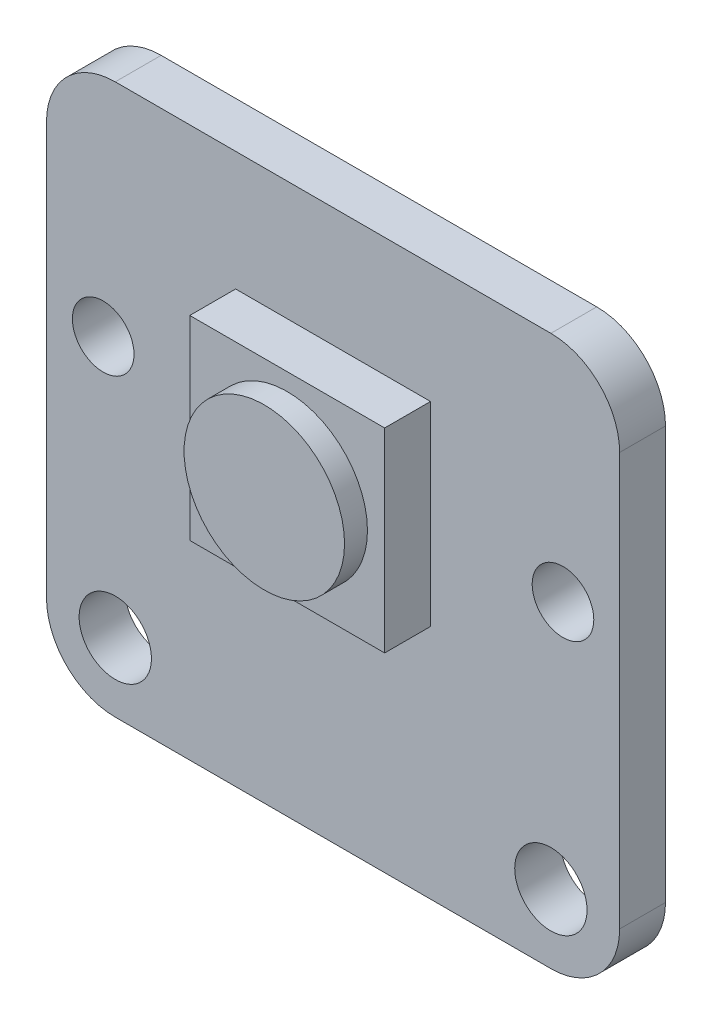
ISO-10303-21;
HEADER;
FILE_DESCRIPTION(('STEP AP214'),'2;1');
FILE_NAME('part.step','',(''),(''),'','','');
FILE_SCHEMA(('AUTOMOTIVE_DESIGN { 1 0 10303 214 1 1 1 1 }'));
ENDSEC;
DATA;
#1=APPLICATION_CONTEXT('core data for automotive mechanical design processes');
#2=APPLICATION_PROTOCOL_DEFINITION('international standard','automotive_design',2000,#1);
#3=PRODUCT_CONTEXT('',#1,'mechanical');
#4=PRODUCT('Part','Part','',(#3));
#5=PRODUCT_RELATED_PRODUCT_CATEGORY('part','',(#4));
#6=PRODUCT_DEFINITION_FORMATION('','',#4);
#7=PRODUCT_DEFINITION_CONTEXT('part definition',#1,'design');
#8=PRODUCT_DEFINITION('design','',#6,#7);
#9=PRODUCT_DEFINITION_SHAPE('','',#8);
#10=(LENGTH_UNIT() NAMED_UNIT(*) SI_UNIT(.MILLI.,.METRE.));
#11=(NAMED_UNIT(*) PLANE_ANGLE_UNIT() SI_UNIT($,.RADIAN.));
#12=(NAMED_UNIT(*) SI_UNIT($,.STERADIAN.) SOLID_ANGLE_UNIT());
#13=UNCERTAINTY_MEASURE_WITH_UNIT(LENGTH_MEASURE(1.E-05),#10,'distance_accuracy_value','');
#14=(GEOMETRIC_REPRESENTATION_CONTEXT(3) GLOBAL_UNCERTAINTY_ASSIGNED_CONTEXT((#13)) GLOBAL_UNIT_ASSIGNED_CONTEXT((#10,
#11,#12)) REPRESENTATION_CONTEXT('',''));
#15=CARTESIAN_POINT('',(0.,0.,0.));
#16=DIRECTION('',(0.,0.,1.));
#17=DIRECTION('',(1.,0.,0.));
#18=AXIS2_PLACEMENT_3D('',#15,#16,#17);
#19=CARTESIAN_POINT('',(9.5,-9.,2.));
#20=DIRECTION('',(0.,0.,-1.));
#21=DIRECTION('',(-1.,0.,0.));
#22=AXIS2_PLACEMENT_3D('',#19,#20,#21);
#23=CYLINDRICAL_SURFACE('',#22,3.);
#24=DIRECTION('',(0.,0.,-1.));
#25=VECTOR('',#24,1.);
#26=CARTESIAN_POINT('',(12.5,-9.,2.));
#27=LINE('',#26,#25);
#28=CARTESIAN_POINT('',(12.5,-9.,2.));
#29=VERTEX_POINT('',#28);
#30=CARTESIAN_POINT('',(12.5,-9.,0.));
#31=VERTEX_POINT('',#30);
#32=EDGE_CURVE('E240',#29,#31,#27,.T.);
#33=ORIENTED_EDGE('',*,*,#32,.F.);
#34=CARTESIAN_POINT('',(9.5,-9.,2.));
#35=DIRECTION('',(0.,0.,1.));
#36=DIRECTION('',(1.,0.,0.));
#37=AXIS2_PLACEMENT_3D('',#34,#35,#36);
#38=CIRCLE('',#37,3.);
#39=CARTESIAN_POINT('',(9.5,-12.,2.));
#40=VERTEX_POINT('',#39);
#41=EDGE_CURVE('E54',#40,#29,#38,.T.);
#42=ORIENTED_EDGE('',*,*,#41,.F.);
#43=DIRECTION('',(0.,0.,-1.));
#44=VECTOR('',#43,1.);
#45=CARTESIAN_POINT('',(9.5,-12.,2.));
#46=LINE('',#45,#44);
#47=CARTESIAN_POINT('',(9.5,-12.,0.));
#48=VERTEX_POINT('',#47);
#49=EDGE_CURVE('E244',#48,#40,#46,.F.);
#50=ORIENTED_EDGE('',*,*,#49,.F.);
#51=CARTESIAN_POINT('',(9.5,-9.,0.));
#52=DIRECTION('',(0.,0.,1.));
#53=DIRECTION('',(1.,0.,0.));
#54=AXIS2_PLACEMENT_3D('',#51,#52,#53);
#55=CIRCLE('',#54,3.);
#56=EDGE_CURVE('E11',#31,#48,#55,.F.);
#57=ORIENTED_EDGE('',*,*,#56,.F.);
#58=EDGE_LOOP('',(#33,#42,#50,#57));
#59=FACE_BOUND('',#58,.T.);
#60=ADVANCED_FACE('F45',(#59),#23,.T.);
#61=CARTESIAN_POINT('',(9.5,9.,2.));
#62=DIRECTION('',(0.,0.,-1.));
#63=DIRECTION('',(-1.,0.,0.));
#64=AXIS2_PLACEMENT_3D('',#61,#62,#63);
#65=CYLINDRICAL_SURFACE('',#64,3.);
#66=DIRECTION('',(0.,0.,-1.));
#67=VECTOR('',#66,1.);
#68=CARTESIAN_POINT('',(9.5,12.,2.));
#69=LINE('',#68,#67);
#70=CARTESIAN_POINT('',(9.5,12.,2.));
#71=VERTEX_POINT('',#70);
#72=CARTESIAN_POINT('',(9.5,12.,0.));
#73=VERTEX_POINT('',#72);
#74=EDGE_CURVE('E225',#71,#73,#69,.T.);
#75=ORIENTED_EDGE('',*,*,#74,.F.);
#76=CARTESIAN_POINT('',(9.5,9.,2.));
#77=DIRECTION('',(0.,0.,1.));
#78=DIRECTION('',(1.,0.,0.));
#79=AXIS2_PLACEMENT_3D('',#76,#77,#78);
#80=CIRCLE('',#79,3.);
#81=CARTESIAN_POINT('',(12.5,9.,2.));
#82=VERTEX_POINT('',#81);
#83=EDGE_CURVE('E233',#82,#71,#80,.T.);
#84=ORIENTED_EDGE('',*,*,#83,.F.);
#85=DIRECTION('',(0.,0.,-1.));
#86=VECTOR('',#85,1.);
#87=CARTESIAN_POINT('',(12.5,9.,2.));
#88=LINE('',#87,#86);
#89=CARTESIAN_POINT('',(12.5,9.,0.));
#90=VERTEX_POINT('',#89);
#91=EDGE_CURVE('E229',#90,#82,#88,.F.);
#92=ORIENTED_EDGE('',*,*,#91,.F.);
#93=CARTESIAN_POINT('',(9.5,9.,0.));
#94=DIRECTION('',(0.,0.,1.));
#95=DIRECTION('',(1.,0.,0.));
#96=AXIS2_PLACEMENT_3D('',#93,#94,#95);
#97=CIRCLE('',#96,3.);
#98=EDGE_CURVE('E236',#73,#90,#97,.F.);
#99=ORIENTED_EDGE('',*,*,#98,.F.);
#100=EDGE_LOOP('',(#75,#84,#92,#99));
#101=FACE_BOUND('',#100,.T.);
#102=ADVANCED_FACE('F323',(#101),#65,.T.);
#103=CARTESIAN_POINT('',(-9.50000000000001,9.,2.));
#104=DIRECTION('',(0.,0.,-1.));
#105=DIRECTION('',(-1.,0.,0.));
#106=AXIS2_PLACEMENT_3D('',#103,#104,#105);
#107=CYLINDRICAL_SURFACE('',#106,3.);
#108=DIRECTION('',(0.,0.,-1.));
#109=VECTOR('',#108,1.);
#110=CARTESIAN_POINT('',(-12.5,9.,2.));
#111=LINE('',#110,#109);
#112=CARTESIAN_POINT('',(-12.5,9.,2.));
#113=VERTEX_POINT('',#112);
#114=CARTESIAN_POINT('',(-12.5,9.,0.));
#115=VERTEX_POINT('',#114);
#116=EDGE_CURVE('E210',#113,#115,#111,.T.);
#117=ORIENTED_EDGE('',*,*,#116,.F.);
#118=CARTESIAN_POINT('',(-9.50000000000001,9.,2.));
#119=DIRECTION('',(0.,0.,1.));
#120=DIRECTION('',(1.,0.,0.));
#121=AXIS2_PLACEMENT_3D('',#118,#119,#120);
#122=CIRCLE('',#121,3.);
#123=CARTESIAN_POINT('',(-9.50000000000001,12.,2.));
#124=VERTEX_POINT('',#123);
#125=EDGE_CURVE('E218',#124,#113,#122,.T.);
#126=ORIENTED_EDGE('',*,*,#125,.F.);
#127=DIRECTION('',(0.,0.,-1.));
#128=VECTOR('',#127,1.);
#129=CARTESIAN_POINT('',(-9.50000000000001,12.,2.));
#130=LINE('',#129,#128);
#131=CARTESIAN_POINT('',(-9.50000000000001,12.,0.));
#132=VERTEX_POINT('',#131);
#133=EDGE_CURVE('E214',#132,#124,#130,.F.);
#134=ORIENTED_EDGE('',*,*,#133,.F.);
#135=CARTESIAN_POINT('',(-9.50000000000001,9.,0.));
#136=DIRECTION('',(0.,0.,1.));
#137=DIRECTION('',(1.,0.,0.));
#138=AXIS2_PLACEMENT_3D('',#135,#136,#137);
#139=CIRCLE('',#138,3.);
#140=EDGE_CURVE('E221',#115,#132,#139,.F.);
#141=ORIENTED_EDGE('',*,*,#140,.F.);
#142=EDGE_LOOP('',(#117,#126,#134,#141));
#143=FACE_BOUND('',#142,.T.);
#144=ADVANCED_FACE('F330',(#143),#107,.T.);
#145=CARTESIAN_POINT('',(-9.5,-9.,2.));
#146=DIRECTION('',(0.,0.,1.));
#147=DIRECTION('',(1.,0.,0.));
#148=AXIS2_PLACEMENT_3D('',#145,#146,#147);
#149=CYLINDRICAL_SURFACE('',#148,3.);
#150=DIRECTION('',(0.,0.,1.));
#151=VECTOR('',#150,1.);
#152=CARTESIAN_POINT('',(-12.5,-9.,2.));
#153=LINE('',#152,#151);
#154=CARTESIAN_POINT('',(-12.5,-9.,0.));
#155=VERTEX_POINT('',#154);
#156=CARTESIAN_POINT('',(-12.5,-9.,2.));
#157=VERTEX_POINT('',#156);
#158=EDGE_CURVE('E195',#155,#157,#153,.T.);
#159=ORIENTED_EDGE('',*,*,#158,.F.);
#160=CARTESIAN_POINT('',(-9.5,-9.,0.));
#161=DIRECTION('',(0.,0.,1.));
#162=DIRECTION('',(1.,0.,0.));
#163=AXIS2_PLACEMENT_3D('',#160,#161,#162);
#164=CIRCLE('',#163,3.);
#165=CARTESIAN_POINT('',(-9.5,-12.,0.));
#166=VERTEX_POINT('',#165);
#167=EDGE_CURVE('E203',#166,#155,#164,.F.);
#168=ORIENTED_EDGE('',*,*,#167,.F.);
#169=DIRECTION('',(0.,0.,1.));
#170=VECTOR('',#169,1.);
#171=CARTESIAN_POINT('',(-9.5,-12.,2.));
#172=LINE('',#171,#170);
#173=CARTESIAN_POINT('',(-9.5,-12.,2.));
#174=VERTEX_POINT('',#173);
#175=EDGE_CURVE('E199',#174,#166,#172,.F.);
#176=ORIENTED_EDGE('',*,*,#175,.F.);
#177=CARTESIAN_POINT('',(-9.5,-9.,2.));
#178=DIRECTION('',(0.,0.,1.));
#179=DIRECTION('',(1.,0.,0.));
#180=AXIS2_PLACEMENT_3D('',#177,#178,#179);
#181=CIRCLE('',#180,3.);
#182=EDGE_CURVE('E207',#157,#174,#181,.T.);
#183=ORIENTED_EDGE('',*,*,#182,.F.);
#184=EDGE_LOOP('',(#159,#168,#176,#183));
#185=FACE_BOUND('',#184,.T.);
#186=ADVANCED_FACE('F338',(#185),#149,.T.);
#187=CARTESIAN_POINT('',(12.5,12.,2.));
#188=DIRECTION('',(-1.,0.,0.));
#189=DIRECTION('',(0.,-1.,0.));
#190=AXIS2_PLACEMENT_3D('',#187,#188,#189);
#191=PLANE('',#190);
#192=DIRECTION('',(0.,1.,0.));
#193=VECTOR('',#192,1.);
#194=CARTESIAN_POINT('',(12.5,12.,2.));
#195=LINE('',#194,#193);
#196=EDGE_CURVE('E172',#29,#82,#195,.T.);
#197=ORIENTED_EDGE('',*,*,#196,.F.);
#198=ORIENTED_EDGE('',*,*,#32,.T.);
#199=DIRECTION('',(0.,1.,0.));
#200=VECTOR('',#199,1.);
#201=CARTESIAN_POINT('',(12.5,12.,0.));
#202=LINE('',#201,#200);
#203=EDGE_CURVE('E162',#31,#90,#202,.T.);
#204=ORIENTED_EDGE('',*,*,#203,.T.);
#205=ORIENTED_EDGE('',*,*,#91,.T.);
#206=EDGE_LOOP('',(#197,#198,#204,#205));
#207=FACE_BOUND('',#206,.T.);
#208=ADVANCED_FACE('F317',(#207),#191,.F.);
#209=CARTESIAN_POINT('',(-12.5,12.,2.));
#210=DIRECTION('',(0.,-1.,0.));
#211=DIRECTION('',(0.,0.,-1.));
#212=AXIS2_PLACEMENT_3D('',#209,#210,#211);
#213=PLANE('',#212);
#214=DIRECTION('',(-1.,0.,0.));
#215=VECTOR('',#214,1.);
#216=CARTESIAN_POINT('',(-12.5,12.,2.));
#217=LINE('',#216,#215);
#218=EDGE_CURVE('E175',#71,#124,#217,.T.);
#219=ORIENTED_EDGE('',*,*,#218,.F.);
#220=ORIENTED_EDGE('',*,*,#74,.T.);
#221=DIRECTION('',(-1.,0.,0.));
#222=VECTOR('',#221,1.);
#223=CARTESIAN_POINT('',(-12.5,12.,0.));
#224=LINE('',#223,#222);
#225=EDGE_CURVE('E166',#73,#132,#224,.T.);
#226=ORIENTED_EDGE('',*,*,#225,.T.);
#227=ORIENTED_EDGE('',*,*,#133,.T.);
#228=EDGE_LOOP('',(#219,#220,#226,#227));
#229=FACE_BOUND('',#228,.T.);
#230=ADVANCED_FACE('F332',(#229),#213,.F.);
#231=CARTESIAN_POINT('',(-12.5,12.,2.));
#232=DIRECTION('',(1.,0.,0.));
#233=DIRECTION('',(0.,1.,0.));
#234=AXIS2_PLACEMENT_3D('',#231,#232,#233);
#235=PLANE('',#234);
#236=DIRECTION('',(0.,-1.,0.));
#237=VECTOR('',#236,1.);
#238=CARTESIAN_POINT('',(-12.5,12.,2.));
#239=LINE('',#238,#237);
#240=EDGE_CURVE('E179',#113,#157,#239,.T.);
#241=ORIENTED_EDGE('',*,*,#240,.F.);
#242=ORIENTED_EDGE('',*,*,#116,.T.);
#243=DIRECTION('',(0.,-1.,0.));
#244=VECTOR('',#243,1.);
#245=CARTESIAN_POINT('',(-12.5,12.,0.));
#246=LINE('',#245,#244);
#247=EDGE_CURVE('E189',#115,#155,#246,.T.);
#248=ORIENTED_EDGE('',*,*,#247,.T.);
#249=ORIENTED_EDGE('',*,*,#158,.T.);
#250=EDGE_LOOP('',(#241,#242,#248,#249));
#251=FACE_BOUND('',#250,.T.);
#252=ADVANCED_FACE('F335',(#251),#235,.F.);
#253=CARTESIAN_POINT('',(-12.5,-12.,2.));
#254=DIRECTION('',(0.,1.,0.));
#255=DIRECTION('',(0.,0.,1.));
#256=AXIS2_PLACEMENT_3D('',#253,#254,#255);
#257=PLANE('',#256);
#258=DIRECTION('',(1.,0.,0.));
#259=VECTOR('',#258,1.);
#260=CARTESIAN_POINT('',(-12.5,-12.,0.));
#261=LINE('',#260,#259);
#262=EDGE_CURVE('E176',#166,#48,#261,.T.);
#263=ORIENTED_EDGE('',*,*,#262,.T.);
#264=ORIENTED_EDGE('',*,*,#49,.T.);
#265=DIRECTION('',(1.,0.,0.));
#266=VECTOR('',#265,1.);
#267=CARTESIAN_POINT('',(-12.5,-12.,2.));
#268=LINE('',#267,#266);
#269=EDGE_CURVE('E182',#174,#40,#268,.T.);
#270=ORIENTED_EDGE('',*,*,#269,.F.);
#271=ORIENTED_EDGE('',*,*,#175,.T.);
#272=EDGE_LOOP('',(#263,#264,#270,#271));
#273=FACE_BOUND('',#272,.T.);
#274=ADVANCED_FACE('F308',(#273),#257,.F.);
#275=CARTESIAN_POINT('',(0.,0.,2.));
#276=DIRECTION('',(0.,0.,1.));
#277=DIRECTION('',(1.,0.,0.));
#278=AXIS2_PLACEMENT_3D('',#275,#276,#277);
#279=PLANE('',#278);
#280=CARTESIAN_POINT('',(10.0278204357793,2.11524337317219,2.));
#281=DIRECTION('',(0.,0.,1.));
#282=DIRECTION('',(-1.,0.,0.));
#283=AXIS2_PLACEMENT_3D('',#280,#281,#282);
#284=CIRCLE('',#283,1.34400514999283);
#285=CARTESIAN_POINT('',(8.68381528578647,2.11524337317219,2.));
#286=VERTEX_POINT('',#285);
#287=EDGE_CURVE('E574',#286,#286,#284,.T.);
#288=ORIENTED_EDGE('',*,*,#287,.F.);
#289=EDGE_LOOP('',(#288));
#290=FACE_BOUND('',#289,.T.);
#291=CARTESIAN_POINT('',(-9.5,-9.,2.));
#292=DIRECTION('',(0.,0.,1.));
#293=DIRECTION('',(1.,0.,0.));
#294=AXIS2_PLACEMENT_3D('',#291,#292,#293);
#295=CIRCLE('',#294,1.57717900274871);
#296=CARTESIAN_POINT('',(-7.92282099725129,-9.,2.));
#297=VERTEX_POINT('',#296);
#298=EDGE_CURVE('E576',#297,#297,#295,.T.);
#299=ORIENTED_EDGE('',*,*,#298,.F.);
#300=EDGE_LOOP('',(#299));
#301=FACE_BOUND('',#300,.T.);
#302=CARTESIAN_POINT('',(9.5,-9.,2.));
#303=DIRECTION('',(0.,0.,1.));
#304=DIRECTION('',(-1.,0.,0.));
#305=AXIS2_PLACEMENT_3D('',#302,#303,#304);
#306=CIRCLE('',#305,1.57717900274871);
#307=CARTESIAN_POINT('',(7.92282099725129,-9.,2.));
#308=VERTEX_POINT('',#307);
#309=EDGE_CURVE('E582',#308,#308,#306,.T.);
#310=ORIENTED_EDGE('',*,*,#309,.F.);
#311=EDGE_LOOP('',(#310));
#312=FACE_BOUND('',#311,.T.);
#313=CARTESIAN_POINT('',(-10.0278204357793,2.11524337317219,2.));
#314=DIRECTION('',(0.,0.,1.));
#315=DIRECTION('',(1.,0.,0.));
#316=AXIS2_PLACEMENT_3D('',#313,#314,#315);
#317=CIRCLE('',#316,1.34400514999283);
#318=CARTESIAN_POINT('',(-8.68381528578647,2.11524337317219,2.));
#319=VERTEX_POINT('',#318);
#320=EDGE_CURVE('E254',#319,#319,#317,.T.);
#321=ORIENTED_EDGE('',*,*,#320,.F.);
#322=EDGE_LOOP('',(#321));
#323=FACE_BOUND('',#322,.T.);
#324=DIRECTION('',(0.,-1.,0.));
#325=VECTOR('',#324,1.);
#326=CARTESIAN_POINT('',(-4.25,6.8,2.));
#327=LINE('',#326,#325);
#328=CARTESIAN_POINT('',(-4.25,6.8,2.));
#329=VERTEX_POINT('',#328);
#330=CARTESIAN_POINT('',(-4.25,-1.7,2.));
#331=VERTEX_POINT('',#330);
#332=EDGE_CURVE('E160',#329,#331,#327,.T.);
#333=ORIENTED_EDGE('',*,*,#332,.F.);
#334=DIRECTION('',(-1.,0.,0.));
#335=VECTOR('',#334,1.);
#336=CARTESIAN_POINT('',(-4.25,6.8,2.));
#337=LINE('',#336,#335);
#338=CARTESIAN_POINT('',(4.25,6.8,2.));
#339=VERTEX_POINT('',#338);
#340=EDGE_CURVE('E157',#339,#329,#337,.T.);
#341=ORIENTED_EDGE('',*,*,#340,.F.);
#342=DIRECTION('',(0.,1.,0.));
#343=VECTOR('',#342,1.);
#344=CARTESIAN_POINT('',(4.25,6.8,2.));
#345=LINE('',#344,#343);
#346=CARTESIAN_POINT('',(4.25,-1.7,2.));
#347=VERTEX_POINT('',#346);
#348=EDGE_CURVE('E288',#347,#339,#345,.T.);
#349=ORIENTED_EDGE('',*,*,#348,.F.);
#350=DIRECTION('',(1.,0.,0.));
#351=VECTOR('',#350,1.);
#352=CARTESIAN_POINT('',(-4.25,-1.7,2.));
#353=LINE('',#352,#351);
#354=EDGE_CURVE('E273',#331,#347,#353,.T.);
#355=ORIENTED_EDGE('',*,*,#354,.F.);
#356=EDGE_LOOP('',(#333,#341,#349,#355));
#357=FACE_BOUND('',#356,.T.);
#358=ORIENTED_EDGE('',*,*,#269,.T.);
#359=ORIENTED_EDGE('',*,*,#41,.T.);
#360=ORIENTED_EDGE('',*,*,#196,.T.);
#361=ORIENTED_EDGE('',*,*,#83,.T.);
#362=ORIENTED_EDGE('',*,*,#218,.T.);
#363=ORIENTED_EDGE('',*,*,#125,.T.);
#364=ORIENTED_EDGE('',*,*,#240,.T.);
#365=ORIENTED_EDGE('',*,*,#182,.T.);
#366=EDGE_LOOP('',(#358,#359,#360,#361,#362,#363,#364,#365));
#367=FACE_BOUND('',#366,.T.);
#368=ADVANCED_FACE('F304',(#290,#301,#312,#323,#357,#367),#279,.T.);
#369=CARTESIAN_POINT('',(0.,0.,0.));
#370=DIRECTION('',(0.,0.,1.));
#371=DIRECTION('',(1.,0.,0.));
#372=AXIS2_PLACEMENT_3D('',#369,#370,#371);
#373=PLANE('',#372);
#374=CARTESIAN_POINT('',(10.0278204357793,2.11524337317219,0.));
#375=DIRECTION('',(0.,0.,1.));
#376=DIRECTION('',(1.,0.,0.));
#377=AXIS2_PLACEMENT_3D('',#374,#375,#376);
#378=CIRCLE('',#377,1.34400514999283);
#379=CARTESIAN_POINT('',(11.3718255857721,2.11524337317219,0.));
#380=VERTEX_POINT('',#379);
#381=EDGE_CURVE('E48',#380,#380,#378,.T.);
#382=ORIENTED_EDGE('',*,*,#381,.T.);
#383=EDGE_LOOP('',(#382));
#384=FACE_BOUND('',#383,.T.);
#385=CARTESIAN_POINT('',(-9.5,-9.,0.));
#386=DIRECTION('',(0.,0.,1.));
#387=DIRECTION('',(1.,0.,0.));
#388=AXIS2_PLACEMENT_3D('',#385,#386,#387);
#389=CIRCLE('',#388,1.57717900274871);
#390=CARTESIAN_POINT('',(-7.92282099725129,-9.,0.));
#391=VERTEX_POINT('',#390);
#392=EDGE_CURVE('E257',#391,#391,#389,.T.);
#393=ORIENTED_EDGE('',*,*,#392,.T.);
#394=EDGE_LOOP('',(#393));
#395=FACE_BOUND('',#394,.T.);
#396=CARTESIAN_POINT('',(9.5,-9.,0.));
#397=DIRECTION('',(0.,0.,1.));
#398=DIRECTION('',(1.,0.,0.));
#399=AXIS2_PLACEMENT_3D('',#396,#397,#398);
#400=CIRCLE('',#399,1.57717900274871);
#401=CARTESIAN_POINT('',(11.0771790027487,-9.,0.));
#402=VERTEX_POINT('',#401);
#403=EDGE_CURVE('E253',#402,#402,#400,.T.);
#404=ORIENTED_EDGE('',*,*,#403,.T.);
#405=EDGE_LOOP('',(#404));
#406=FACE_BOUND('',#405,.T.);
#407=CARTESIAN_POINT('',(-10.0278204357793,2.11524337317219,0.));
#408=DIRECTION('',(0.,0.,1.));
#409=DIRECTION('',(1.,0.,0.));
#410=AXIS2_PLACEMENT_3D('',#407,#408,#409);
#411=CIRCLE('',#410,1.34400514999283);
#412=CARTESIAN_POINT('',(-8.68381528578647,2.11524337317219,0.));
#413=VERTEX_POINT('',#412);
#414=EDGE_CURVE('E249',#413,#413,#411,.T.);
#415=ORIENTED_EDGE('',*,*,#414,.T.);
#416=EDGE_LOOP('',(#415));
#417=FACE_BOUND('',#416,.T.);
#418=ORIENTED_EDGE('',*,*,#203,.F.);
#419=ORIENTED_EDGE('',*,*,#56,.T.);
#420=ORIENTED_EDGE('',*,*,#262,.F.);
#421=ORIENTED_EDGE('',*,*,#167,.T.);
#422=ORIENTED_EDGE('',*,*,#247,.F.);
#423=ORIENTED_EDGE('',*,*,#140,.T.);
#424=ORIENTED_EDGE('',*,*,#225,.F.);
#425=ORIENTED_EDGE('',*,*,#98,.T.);
#426=EDGE_LOOP('',(#418,#419,#420,#421,#422,#423,#424,#425));
#427=FACE_BOUND('',#426,.T.);
#428=ADVANCED_FACE('F307',(#384,#395,#406,#417,#427),#373,.F.);
#429=CARTESIAN_POINT('',(-4.25,6.8,4.));
#430=DIRECTION('',(1.,0.,0.));
#431=DIRECTION('',(0.,1.,0.));
#432=AXIS2_PLACEMENT_3D('',#429,#430,#431);
#433=PLANE('',#432);
#434=ORIENTED_EDGE('',*,*,#332,.T.);
#435=DIRECTION('',(0.,0.,-1.));
#436=VECTOR('',#435,1.);
#437=CARTESIAN_POINT('',(-4.25,-1.7,4.));
#438=LINE('',#437,#436);
#439=CARTESIAN_POINT('',(-4.25,-1.7,4.));
#440=VERTEX_POINT('',#439);
#441=EDGE_CURVE('E139',#440,#331,#438,.T.);
#442=ORIENTED_EDGE('',*,*,#441,.F.);
#443=DIRECTION('',(0.,-1.,0.));
#444=VECTOR('',#443,1.);
#445=CARTESIAN_POINT('',(-4.25,6.8,4.));
#446=LINE('',#445,#444);
#447=CARTESIAN_POINT('',(-4.25,6.8,4.));
#448=VERTEX_POINT('',#447);
#449=EDGE_CURVE('E147',#448,#440,#446,.T.);
#450=ORIENTED_EDGE('',*,*,#449,.F.);
#451=DIRECTION('',(0.,0.,-1.));
#452=VECTOR('',#451,1.);
#453=CARTESIAN_POINT('',(-4.25,6.8,4.));
#454=LINE('',#453,#452);
#455=EDGE_CURVE('E284',#448,#329,#454,.T.);
#456=ORIENTED_EDGE('',*,*,#455,.T.);
#457=EDGE_LOOP('',(#434,#442,#450,#456));
#458=FACE_BOUND('',#457,.T.);
#459=ADVANCED_FACE('F159',(#458),#433,.F.);
#460=CARTESIAN_POINT('',(-4.25,-1.7,4.));
#461=DIRECTION('',(0.,1.,0.));
#462=DIRECTION('',(0.,0.,1.));
#463=AXIS2_PLACEMENT_3D('',#460,#461,#462);
#464=PLANE('',#463);
#465=ORIENTED_EDGE('',*,*,#354,.T.);
#466=DIRECTION('',(0.,0.,-1.));
#467=VECTOR('',#466,1.);
#468=CARTESIAN_POINT('',(4.25,-1.7,4.));
#469=LINE('',#468,#467);
#470=CARTESIAN_POINT('',(4.25,-1.7,4.));
#471=VERTEX_POINT('',#470);
#472=EDGE_CURVE('E142',#471,#347,#469,.T.);
#473=ORIENTED_EDGE('',*,*,#472,.F.);
#474=DIRECTION('',(1.,0.,0.));
#475=VECTOR('',#474,1.);
#476=CARTESIAN_POINT('',(-4.25,-1.7,4.));
#477=LINE('',#476,#475);
#478=EDGE_CURVE('E134',#440,#471,#477,.T.);
#479=ORIENTED_EDGE('',*,*,#478,.F.);
#480=ORIENTED_EDGE('',*,*,#441,.T.);
#481=EDGE_LOOP('',(#465,#473,#479,#480));
#482=FACE_BOUND('',#481,.T.);
#483=ADVANCED_FACE('F137',(#482),#464,.F.);
#484=CARTESIAN_POINT('',(4.25,6.8,4.));
#485=DIRECTION('',(-1.,0.,0.));
#486=DIRECTION('',(0.,-1.,0.));
#487=AXIS2_PLACEMENT_3D('',#484,#485,#486);
#488=PLANE('',#487);
#489=ORIENTED_EDGE('',*,*,#348,.T.);
#490=DIRECTION('',(0.,0.,-1.));
#491=VECTOR('',#490,1.);
#492=CARTESIAN_POINT('',(4.25,6.8,4.));
#493=LINE('',#492,#491);
#494=CARTESIAN_POINT('',(4.25,6.8,4.));
#495=VERTEX_POINT('',#494);
#496=EDGE_CURVE('E168',#495,#339,#493,.T.);
#497=ORIENTED_EDGE('',*,*,#496,.F.);
#498=DIRECTION('',(0.,1.,0.));
#499=VECTOR('',#498,1.);
#500=CARTESIAN_POINT('',(4.25,6.8,4.));
#501=LINE('',#500,#499);
#502=EDGE_CURVE('E146',#471,#495,#501,.T.);
#503=ORIENTED_EDGE('',*,*,#502,.F.);
#504=ORIENTED_EDGE('',*,*,#472,.T.);
#505=EDGE_LOOP('',(#489,#497,#503,#504));
#506=FACE_BOUND('',#505,.T.);
#507=ADVANCED_FACE('F302',(#506),#488,.F.);
#508=CARTESIAN_POINT('',(-4.25,6.8,4.));
#509=DIRECTION('',(0.,-1.,0.));
#510=DIRECTION('',(0.,0.,-1.));
#511=AXIS2_PLACEMENT_3D('',#508,#509,#510);
#512=PLANE('',#511);
#513=ORIENTED_EDGE('',*,*,#340,.T.);
#514=ORIENTED_EDGE('',*,*,#455,.F.);
#515=DIRECTION('',(-1.,0.,0.));
#516=VECTOR('',#515,1.);
#517=CARTESIAN_POINT('',(-4.25,6.8,4.));
#518=LINE('',#517,#516);
#519=EDGE_CURVE('E152',#495,#448,#518,.T.);
#520=ORIENTED_EDGE('',*,*,#519,.F.);
#521=ORIENTED_EDGE('',*,*,#496,.T.);
#522=EDGE_LOOP('',(#513,#514,#520,#521));
#523=FACE_BOUND('',#522,.T.);
#524=ADVANCED_FACE('F300',(#523),#512,.F.);
#525=CARTESIAN_POINT('',(0.,0.,4.));
#526=DIRECTION('',(0.,0.,1.));
#527=DIRECTION('',(1.,0.,0.));
#528=AXIS2_PLACEMENT_3D('',#525,#526,#527);
#529=PLANE('',#528);
#530=CARTESIAN_POINT('',(0.,2.55,4.));
#531=DIRECTION('',(0.,0.,1.));
#532=DIRECTION('',(1.,0.,0.));
#533=AXIS2_PLACEMENT_3D('',#530,#531,#532);
#534=CIRCLE('',#533,3.5);
#535=CARTESIAN_POINT('',(3.5,2.55,4.));
#536=VERTEX_POINT('',#535);
#537=EDGE_CURVE('E185',#536,#536,#534,.T.);
#538=ORIENTED_EDGE('',*,*,#537,.F.);
#539=EDGE_LOOP('',(#538));
#540=FACE_BOUND('',#539,.T.);
#541=ORIENTED_EDGE('',*,*,#449,.T.);
#542=ORIENTED_EDGE('',*,*,#478,.T.);
#543=ORIENTED_EDGE('',*,*,#502,.T.);
#544=ORIENTED_EDGE('',*,*,#519,.T.);
#545=EDGE_LOOP('',(#541,#542,#543,#544));
#546=FACE_BOUND('',#545,.T.);
#547=ADVANCED_FACE('F150',(#540,#546),#529,.T.);
#548=CARTESIAN_POINT('',(0.,2.55,5.));
#549=DIRECTION('',(0.,0.,-1.));
#550=DIRECTION('',(-1.,0.,0.));
#551=AXIS2_PLACEMENT_3D('',#548,#549,#550);
#552=CYLINDRICAL_SURFACE('',#551,3.5);
#553=CARTESIAN_POINT('',(0.,2.55,5.));
#554=DIRECTION('',(0.,0.,1.));
#555=DIRECTION('',(1.,0.,0.));
#556=AXIS2_PLACEMENT_3D('',#553,#554,#555);
#557=CIRCLE('',#556,3.5);
#558=CARTESIAN_POINT('',(3.5,2.55,5.));
#559=VERTEX_POINT('',#558);
#560=EDGE_CURVE('E264',#559,#559,#557,.T.);
#561=ORIENTED_EDGE('',*,*,#560,.F.);
#562=EDGE_LOOP('',(#561));
#563=FACE_BOUND('',#562,.T.);
#564=ORIENTED_EDGE('',*,*,#537,.T.);
#565=EDGE_LOOP('',(#564));
#566=FACE_BOUND('',#565,.T.);
#567=ADVANCED_FACE('F424',(#563,#566),#552,.T.);
#568=CARTESIAN_POINT('',(0.,2.55,5.));
#569=DIRECTION('',(0.,0.,1.));
#570=DIRECTION('',(1.,0.,0.));
#571=AXIS2_PLACEMENT_3D('',#568,#569,#570);
#572=PLANE('',#571);
#573=ORIENTED_EDGE('',*,*,#560,.T.);
#574=EDGE_LOOP('',(#573));
#575=FACE_BOUND('',#574,.T.);
#576=ADVANCED_FACE('F433',(#575),#572,.T.);
#577=CARTESIAN_POINT('',(-10.0278204357793,2.11524337317219,-19.));
#578=DIRECTION('',(0.,0.,1.));
#579=DIRECTION('',(1.,0.,0.));
#580=AXIS2_PLACEMENT_3D('',#577,#578,#579);
#581=CYLINDRICAL_SURFACE('',#580,1.34400514999283);
#582=ORIENTED_EDGE('',*,*,#320,.T.);
#583=EDGE_LOOP('',(#582));
#584=FACE_BOUND('',#583,.T.);
#585=ORIENTED_EDGE('',*,*,#414,.F.);
#586=EDGE_LOOP('',(#585));
#587=FACE_BOUND('',#586,.T.);
#588=ADVANCED_FACE('F440',(#584,#587),#581,.F.);
#589=CARTESIAN_POINT('',(9.5,-9.,-19.));
#590=DIRECTION('',(0.,0.,1.));
#591=DIRECTION('',(1.,0.,0.));
#592=AXIS2_PLACEMENT_3D('',#589,#590,#591);
#593=CYLINDRICAL_SURFACE('',#592,1.57717900274871);
#594=ORIENTED_EDGE('',*,*,#309,.T.);
#595=EDGE_LOOP('',(#594));
#596=FACE_BOUND('',#595,.T.);
#597=ORIENTED_EDGE('',*,*,#403,.F.);
#598=EDGE_LOOP('',(#597));
#599=FACE_BOUND('',#598,.T.);
#600=ADVANCED_FACE('F445',(#596,#599),#593,.F.);
#601=CARTESIAN_POINT('',(-9.5,-9.,-19.));
#602=DIRECTION('',(0.,0.,1.));
#603=DIRECTION('',(1.,0.,0.));
#604=AXIS2_PLACEMENT_3D('',#601,#602,#603);
#605=CYLINDRICAL_SURFACE('',#604,1.57717900274871);
#606=ORIENTED_EDGE('',*,*,#298,.T.);
#607=EDGE_LOOP('',(#606));
#608=FACE_BOUND('',#607,.T.);
#609=ORIENTED_EDGE('',*,*,#392,.F.);
#610=EDGE_LOOP('',(#609));
#611=FACE_BOUND('',#610,.T.);
#612=ADVANCED_FACE('F453',(#608,#611),#605,.F.);
#613=CARTESIAN_POINT('',(10.0278204357793,2.11524337317219,-19.));
#614=DIRECTION('',(0.,0.,1.));
#615=DIRECTION('',(1.,0.,0.));
#616=AXIS2_PLACEMENT_3D('',#613,#614,#615);
#617=CYLINDRICAL_SURFACE('',#616,1.34400514999283);
#618=ORIENTED_EDGE('',*,*,#287,.T.);
#619=EDGE_LOOP('',(#618));
#620=FACE_BOUND('',#619,.T.);
#621=ORIENTED_EDGE('',*,*,#381,.F.);
#622=EDGE_LOOP('',(#621));
#623=FACE_BOUND('',#622,.T.);
#624=ADVANCED_FACE('F461',(#620,#623),#617,.F.);
#625=CLOSED_SHELL('',(#60,#102,#144,#186,#208,#230,#252,#274,#368,#428,#459,#483,#507,#524,#547,
#567,#576,#588,#600,#612,#624));
#626=MANIFOLD_SOLID_BREP('B2',#625);
#627=ADVANCED_BREP_SHAPE_REPRESENTATION('',(#18,#626),#14);
#628=SHAPE_DEFINITION_REPRESENTATION(#9,#627);
ENDSEC;
END-ISO-10303-21;
